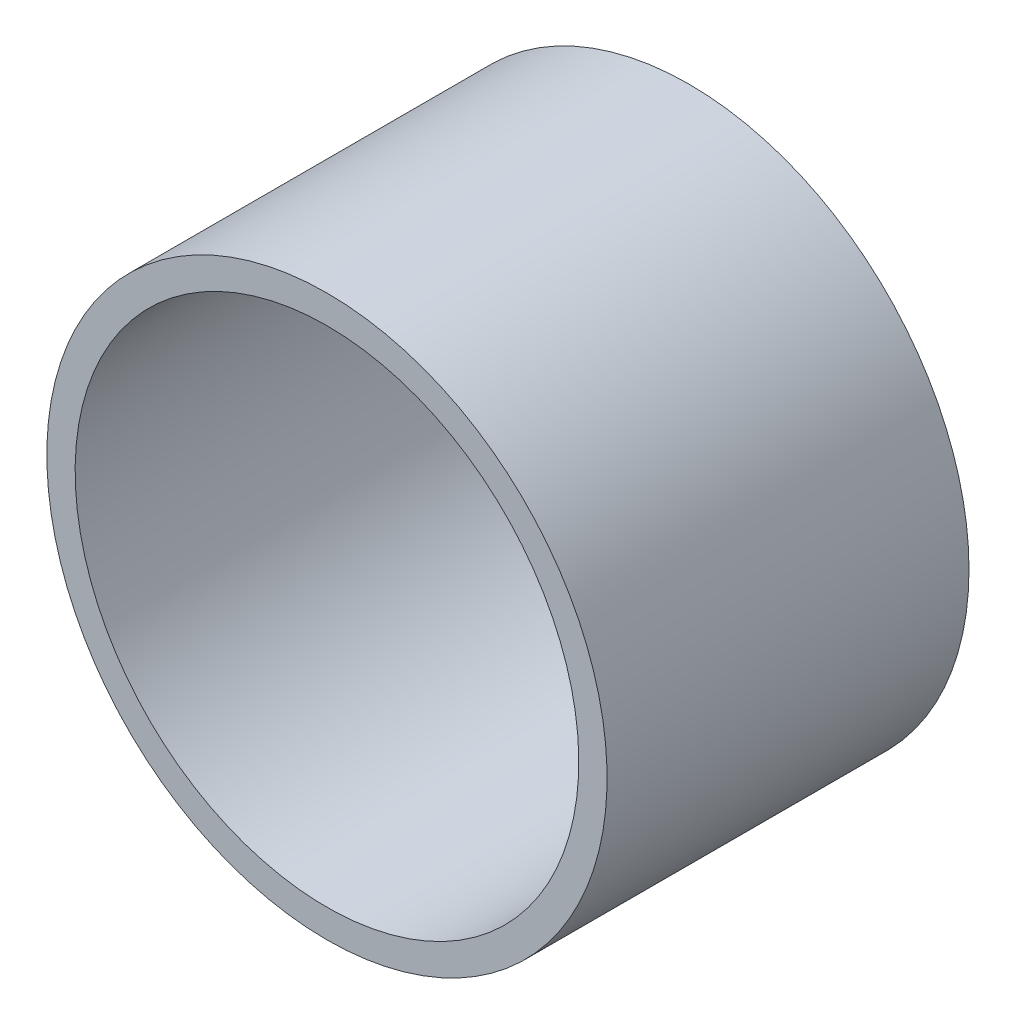
ISO-10303-21;
HEADER;
FILE_DESCRIPTION(('STEP AP214'),'2;1');
FILE_NAME('part.step','',(''),(''),'','','');
FILE_SCHEMA(('AUTOMOTIVE_DESIGN { 1 0 10303 214 1 1 1 1 }'));
ENDSEC;
DATA;
#1=APPLICATION_CONTEXT('core data for automotive mechanical design processes');
#2=APPLICATION_PROTOCOL_DEFINITION('international standard','automotive_design',2000,#1);
#3=PRODUCT_CONTEXT('',#1,'mechanical');
#4=PRODUCT('Part','Part','',(#3));
#5=PRODUCT_RELATED_PRODUCT_CATEGORY('part','',(#4));
#6=PRODUCT_DEFINITION_FORMATION('','',#4);
#7=PRODUCT_DEFINITION_CONTEXT('part definition',#1,'design');
#8=PRODUCT_DEFINITION('design','',#6,#7);
#9=PRODUCT_DEFINITION_SHAPE('','',#8);
#10=(LENGTH_UNIT() NAMED_UNIT(*) SI_UNIT(.MILLI.,.METRE.));
#11=(NAMED_UNIT(*) PLANE_ANGLE_UNIT() SI_UNIT($,.RADIAN.));
#12=(NAMED_UNIT(*) SI_UNIT($,.STERADIAN.) SOLID_ANGLE_UNIT());
#13=UNCERTAINTY_MEASURE_WITH_UNIT(LENGTH_MEASURE(1.E-05),#10,'distance_accuracy_value','');
#14=(GEOMETRIC_REPRESENTATION_CONTEXT(3) GLOBAL_UNCERTAINTY_ASSIGNED_CONTEXT((#13)) GLOBAL_UNIT_ASSIGNED_CONTEXT((#10,
#11,#12)) REPRESENTATION_CONTEXT('',''));
#15=CARTESIAN_POINT('',(0.,0.,0.));
#16=DIRECTION('',(0.,0.,1.));
#17=DIRECTION('',(1.,0.,0.));
#18=AXIS2_PLACEMENT_3D('',#15,#16,#17);
#19=CARTESIAN_POINT('',(0.,0.,0.));
#20=DIRECTION('',(0.,0.,1.));
#21=DIRECTION('',(1.,0.,0.));
#22=AXIS2_PLACEMENT_3D('',#19,#20,#21);
#23=PLANE('',#22);
#24=CARTESIAN_POINT('',(0.,0.,0.));
#25=DIRECTION('',(0.,0.,1.));
#26=DIRECTION('',(1.,0.,0.));
#27=AXIS2_PLACEMENT_3D('',#24,#25,#26);
#28=CIRCLE('',#27,25.146);
#29=CARTESIAN_POINT('',(25.146,0.,0.));
#30=VERTEX_POINT('',#29);
#31=EDGE_CURVE('E44',#30,#30,#28,.T.);
#32=ORIENTED_EDGE('',*,*,#31,.F.);
#33=EDGE_LOOP('',(#32));
#34=FACE_BOUND('',#33,.T.);
#35=CARTESIAN_POINT('',(0.,0.,0.));
#36=DIRECTION('',(0.,0.,1.));
#37=DIRECTION('',(1.,0.,0.));
#38=AXIS2_PLACEMENT_3D('',#35,#36,#37);
#39=CIRCLE('',#38,22.606);
#40=CARTESIAN_POINT('',(22.606,0.,0.));
#41=VERTEX_POINT('',#40);
#42=EDGE_CURVE('E53',#41,#41,#39,.T.);
#43=ORIENTED_EDGE('',*,*,#42,.T.);
#44=EDGE_LOOP('',(#43));
#45=FACE_BOUND('',#44,.T.);
#46=ADVANCED_FACE('F37',(#34,#45),#23,.F.);
#47=CARTESIAN_POINT('',(0.,0.,103.610503478873));
#48=DIRECTION('',(0.,0.,-1.));
#49=DIRECTION('',(-1.,0.,0.));
#50=AXIS2_PLACEMENT_3D('',#47,#48,#49);
#51=CYLINDRICAL_SURFACE('',#50,25.146);
#52=CARTESIAN_POINT('',(0.,0.,32.4868750000052));
#53=DIRECTION('',(0.,0.,-1.));
#54=DIRECTION('',(0.,1.,0.));
#55=AXIS2_PLACEMENT_3D('',#52,#53,#54);
#56=CIRCLE('',#55,25.146);
#57=CARTESIAN_POINT('',(0.,25.146,32.4868750000052));
#58=VERTEX_POINT('',#57);
#59=EDGE_CURVE('E48',#58,#58,#56,.T.);
#60=ORIENTED_EDGE('',*,*,#59,.T.);
#61=EDGE_LOOP('',(#60));
#62=FACE_BOUND('',#61,.T.);
#63=ORIENTED_EDGE('',*,*,#31,.T.);
#64=EDGE_LOOP('',(#63));
#65=FACE_BOUND('',#64,.T.);
#66=ADVANCED_FACE('F61',(#62,#65),#51,.T.);
#67=CARTESIAN_POINT('',(0.,0.,103.610503478873));
#68=DIRECTION('',(0.,0.,-1.));
#69=DIRECTION('',(-1.,0.,0.));
#70=AXIS2_PLACEMENT_3D('',#67,#68,#69);
#71=CYLINDRICAL_SURFACE('',#70,22.606);
#72=CARTESIAN_POINT('',(0.,0.,32.4868750000052));
#73=DIRECTION('',(0.,0.,-1.));
#74=DIRECTION('',(0.,1.,0.));
#75=AXIS2_PLACEMENT_3D('',#72,#73,#74);
#76=CIRCLE('',#75,22.606);
#77=CARTESIAN_POINT('',(0.,22.606,32.4868750000052));
#78=VERTEX_POINT('',#77);
#79=EDGE_CURVE('E10',#78,#78,#76,.T.);
#80=ORIENTED_EDGE('',*,*,#79,.F.);
#81=EDGE_LOOP('',(#80));
#82=FACE_BOUND('',#81,.T.);
#83=ORIENTED_EDGE('',*,*,#42,.F.);
#84=EDGE_LOOP('',(#83));
#85=FACE_BOUND('',#84,.T.);
#86=ADVANCED_FACE('F59',(#82,#85),#71,.F.);
#87=CARTESIAN_POINT('',(8.32351693713598E-13,6.66753048619044E-13,32.4868750000052));
#88=DIRECTION('',(0.,0.,-1.));
#89=DIRECTION('',(-0.893902021698178,-0.448262395928891,0.));
#90=AXIS2_PLACEMENT_3D('',#87,#88,#89);
#91=PLANE('',#90);
#92=ORIENTED_EDGE('',*,*,#79,.T.);
#93=EDGE_LOOP('',(#92));
#94=FACE_BOUND('',#93,.T.);
#95=ORIENTED_EDGE('',*,*,#59,.F.);
#96=EDGE_LOOP('',(#95));
#97=FACE_BOUND('',#96,.T.);
#98=ADVANCED_FACE('F39',(#94,#97),#91,.F.);
#99=CLOSED_SHELL('',(#46,#66,#86,#98));
#100=MANIFOLD_SOLID_BREP('B2',#99);
#101=ADVANCED_BREP_SHAPE_REPRESENTATION('',(#18,#100),#14);
#102=SHAPE_DEFINITION_REPRESENTATION(#9,#101);
ENDSEC;
END-ISO-10303-21;
